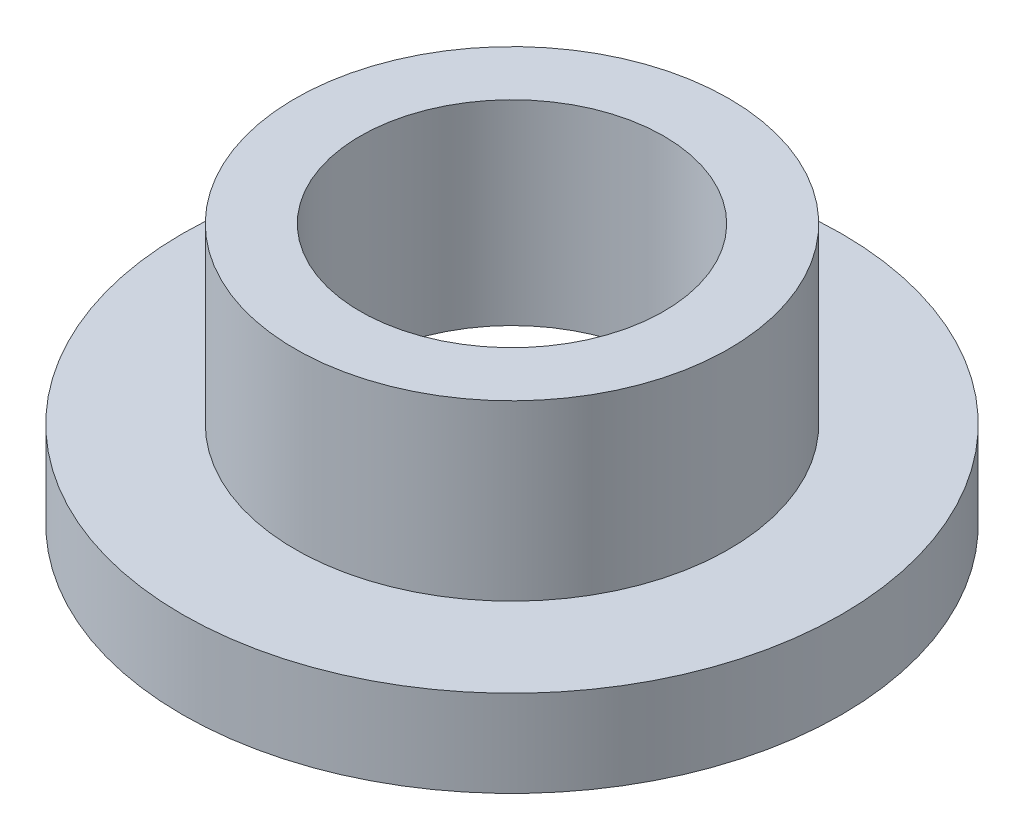
ISO-10303-21;
HEADER;
FILE_DESCRIPTION(('STEP AP214'),'2;1');
FILE_NAME('part.step','',(''),(''),'','','');
FILE_SCHEMA(('AUTOMOTIVE_DESIGN { 1 0 10303 214 1 1 1 1 }'));
ENDSEC;
DATA;
#1=APPLICATION_CONTEXT('core data for automotive mechanical design processes');
#2=APPLICATION_PROTOCOL_DEFINITION('international standard','automotive_design',2000,#1);
#3=PRODUCT_CONTEXT('',#1,'mechanical');
#4=PRODUCT('Part','Part','',(#3));
#5=PRODUCT_RELATED_PRODUCT_CATEGORY('part','',(#4));
#6=PRODUCT_DEFINITION_FORMATION('','',#4);
#7=PRODUCT_DEFINITION_CONTEXT('part definition',#1,'design');
#8=PRODUCT_DEFINITION('design','',#6,#7);
#9=PRODUCT_DEFINITION_SHAPE('','',#8);
#10=(LENGTH_UNIT() NAMED_UNIT(*) SI_UNIT(.MILLI.,.METRE.));
#11=(NAMED_UNIT(*) PLANE_ANGLE_UNIT() SI_UNIT($,.RADIAN.));
#12=(NAMED_UNIT(*) SI_UNIT($,.STERADIAN.) SOLID_ANGLE_UNIT());
#13=UNCERTAINTY_MEASURE_WITH_UNIT(LENGTH_MEASURE(1.E-05),#10,'distance_accuracy_value','');
#14=(GEOMETRIC_REPRESENTATION_CONTEXT(3) GLOBAL_UNCERTAINTY_ASSIGNED_CONTEXT((#13)) GLOBAL_UNIT_ASSIGNED_CONTEXT((#10,
#11,#12)) REPRESENTATION_CONTEXT('',''));
#15=CARTESIAN_POINT('',(0.,0.,0.));
#16=DIRECTION('',(0.,0.,1.));
#17=DIRECTION('',(1.,0.,0.));
#18=AXIS2_PLACEMENT_3D('',#15,#16,#17);
#19=CARTESIAN_POINT('',(0.,10.,0.));
#20=DIRECTION('',(0.,-1.,0.));
#21=DIRECTION('',(0.,0.,-1.));
#22=AXIS2_PLACEMENT_3D('',#19,#20,#21);
#23=PLANE('',#22);
#24=CARTESIAN_POINT('',(0.,10.,0.));
#25=DIRECTION('',(0.,-1.,0.));
#26=DIRECTION('',(0.,0.,-1.));
#27=AXIS2_PLACEMENT_3D('',#24,#25,#26);
#28=CIRCLE('',#27,38.);
#29=CARTESIAN_POINT('',(0.,10.,-38.));
#30=VERTEX_POINT('',#29);
#31=EDGE_CURVE('E61',#30,#30,#28,.T.);
#32=ORIENTED_EDGE('',*,*,#31,.F.);
#33=EDGE_LOOP('',(#32));
#34=FACE_BOUND('',#33,.T.);
#35=CARTESIAN_POINT('',(0.,10.,0.));
#36=DIRECTION('',(0.,-1.,0.));
#37=DIRECTION('',(0.,0.,-1.));
#38=AXIS2_PLACEMENT_3D('',#35,#36,#37);
#39=CIRCLE('',#38,25.);
#40=CARTESIAN_POINT('',(0.,10.,-25.));
#41=VERTEX_POINT('',#40);
#42=EDGE_CURVE('E10',#41,#41,#39,.T.);
#43=ORIENTED_EDGE('',*,*,#42,.T.);
#44=EDGE_LOOP('',(#43));
#45=FACE_BOUND('',#44,.T.);
#46=ADVANCED_FACE('F39',(#34,#45),#23,.F.);
#47=CARTESIAN_POINT('',(0.,0.,0.));
#48=DIRECTION('',(0.,-1.,0.));
#49=DIRECTION('',(0.,0.,-1.));
#50=AXIS2_PLACEMENT_3D('',#47,#48,#49);
#51=CYLINDRICAL_SURFACE('',#50,25.);
#52=ORIENTED_EDGE('',*,*,#42,.F.);
#53=EDGE_LOOP('',(#52));
#54=FACE_BOUND('',#53,.T.);
#55=CARTESIAN_POINT('',(0.,30.,0.));
#56=DIRECTION('',(0.,-1.,0.));
#57=DIRECTION('',(0.,0.,-1.));
#58=AXIS2_PLACEMENT_3D('',#55,#56,#57);
#59=CIRCLE('',#58,25.);
#60=CARTESIAN_POINT('',(0.,30.,-25.));
#61=VERTEX_POINT('',#60);
#62=EDGE_CURVE('E45',#61,#61,#59,.T.);
#63=ORIENTED_EDGE('',*,*,#62,.T.);
#64=EDGE_LOOP('',(#63));
#65=FACE_BOUND('',#64,.T.);
#66=ADVANCED_FACE('F69',(#54,#65),#51,.T.);
#67=CARTESIAN_POINT('',(0.,30.,0.));
#68=DIRECTION('',(0.,-1.,0.));
#69=DIRECTION('',(0.,0.,-1.));
#70=AXIS2_PLACEMENT_3D('',#67,#68,#69);
#71=PLANE('',#70);
#72=ORIENTED_EDGE('',*,*,#62,.F.);
#73=EDGE_LOOP('',(#72));
#74=FACE_BOUND('',#73,.T.);
#75=CARTESIAN_POINT('',(0.,30.,0.));
#76=DIRECTION('',(0.,-1.,0.));
#77=DIRECTION('',(0.,0.,-1.));
#78=AXIS2_PLACEMENT_3D('',#75,#76,#77);
#79=CIRCLE('',#78,17.5);
#80=CARTESIAN_POINT('',(0.,30.,-17.5));
#81=VERTEX_POINT('',#80);
#82=EDGE_CURVE('E49',#81,#81,#79,.T.);
#83=ORIENTED_EDGE('',*,*,#82,.T.);
#84=EDGE_LOOP('',(#83));
#85=FACE_BOUND('',#84,.T.);
#86=ADVANCED_FACE('F73',(#74,#85),#71,.F.);
#87=CARTESIAN_POINT('',(0.,0.,0.));
#88=DIRECTION('',(0.,-1.,0.));
#89=DIRECTION('',(0.,0.,-1.));
#90=AXIS2_PLACEMENT_3D('',#87,#88,#89);
#91=CYLINDRICAL_SURFACE('',#90,17.5);
#92=ORIENTED_EDGE('',*,*,#82,.F.);
#93=EDGE_LOOP('',(#92));
#94=FACE_BOUND('',#93,.T.);
#95=CARTESIAN_POINT('',(0.,7.46138980245717,0.));
#96=DIRECTION('',(0.,-1.,0.));
#97=DIRECTION('',(0.,0.,-1.));
#98=AXIS2_PLACEMENT_3D('',#95,#96,#97);
#99=CIRCLE('',#98,17.5);
#100=CARTESIAN_POINT('',(0.,7.46138980245717,-17.5));
#101=VERTEX_POINT('',#100);
#102=EDGE_CURVE('E53',#101,#101,#99,.T.);
#103=ORIENTED_EDGE('',*,*,#102,.T.);
#104=EDGE_LOOP('',(#103));
#105=FACE_BOUND('',#104,.T.);
#106=ADVANCED_FACE('F78',(#94,#105),#91,.F.);
#107=CARTESIAN_POINT('',(0.,7.46138980245717,0.));
#108=DIRECTION('',(0.,-1.,0.));
#109=DIRECTION('',(0.,0.,-1.));
#110=AXIS2_PLACEMENT_3D('',#107,#108,#109);
#111=CONICAL_SURFACE('',#110,17.5,1.22173047639603);
#112=CARTESIAN_POINT('',(0.,0.,0.));
#113=DIRECTION('',(0.,-1.,0.));
#114=DIRECTION('',(0.,0.,-1.));
#115=AXIS2_PLACEMENT_3D('',#112,#113,#114);
#116=CIRCLE('',#115,38.);
#117=CARTESIAN_POINT('',(0.,0.,-38.));
#118=VERTEX_POINT('',#117);
#119=EDGE_CURVE('E58',#118,#118,#116,.T.);
#120=ORIENTED_EDGE('',*,*,#119,.T.);
#121=EDGE_LOOP('',(#120));
#122=FACE_BOUND('',#121,.T.);
#123=ORIENTED_EDGE('',*,*,#102,.F.);
#124=EDGE_LOOP('',(#123));
#125=FACE_BOUND('',#124,.T.);
#126=ADVANCED_FACE('F84',(#122,#125),#111,.F.);
#127=CARTESIAN_POINT('',(0.,0.,0.));
#128=DIRECTION('',(0.,-1.,0.));
#129=DIRECTION('',(0.,0.,-1.));
#130=AXIS2_PLACEMENT_3D('',#127,#128,#129);
#131=CYLINDRICAL_SURFACE('',#130,38.);
#132=ORIENTED_EDGE('',*,*,#31,.T.);
#133=EDGE_LOOP('',(#132));
#134=FACE_BOUND('',#133,.T.);
#135=ORIENTED_EDGE('',*,*,#119,.F.);
#136=EDGE_LOOP('',(#135));
#137=FACE_BOUND('',#136,.T.);
#138=ADVANCED_FACE('F65',(#134,#137),#131,.T.);
#139=CLOSED_SHELL('',(#46,#66,#86,#106,#126,#138));
#140=MANIFOLD_SOLID_BREP('B2',#139);
#141=ADVANCED_BREP_SHAPE_REPRESENTATION('',(#18,#140),#14);
#142=SHAPE_DEFINITION_REPRESENTATION(#9,#141);
ENDSEC;
END-ISO-10303-21;
